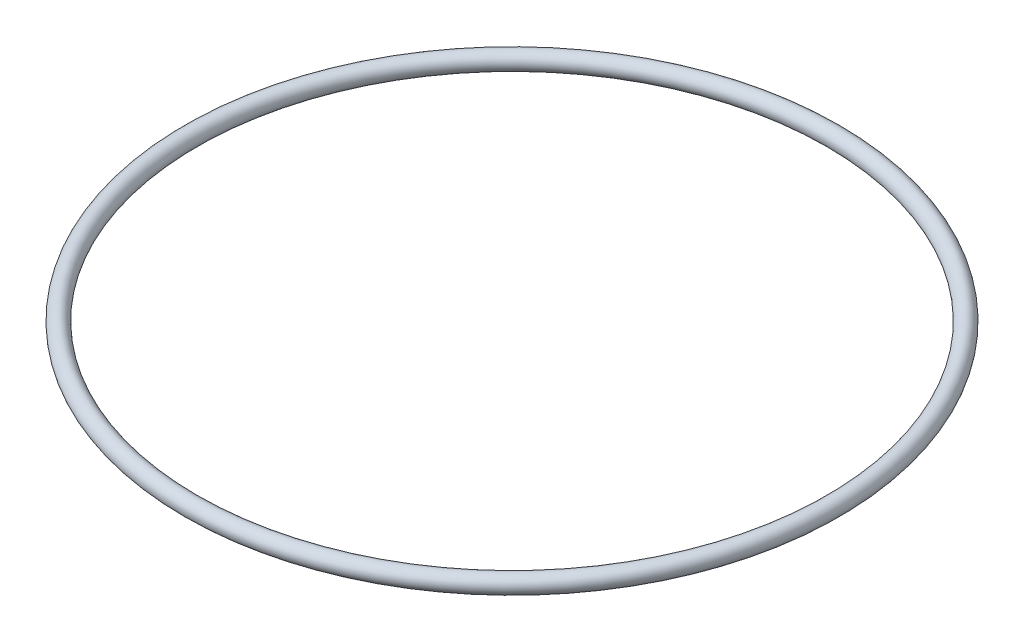
ISO-10303-21;
HEADER;
FILE_DESCRIPTION(('STEP AP214'),'2;1');
FILE_NAME('part.step','',(''),(''),'','','');
FILE_SCHEMA(('AUTOMOTIVE_DESIGN { 1 0 10303 214 1 1 1 1 }'));
ENDSEC;
DATA;
#1=APPLICATION_CONTEXT('core data for automotive mechanical design processes');
#2=APPLICATION_PROTOCOL_DEFINITION('international standard','automotive_design',2000,#1);
#3=PRODUCT_CONTEXT('',#1,'mechanical');
#4=PRODUCT('Part','Part','',(#3));
#5=PRODUCT_RELATED_PRODUCT_CATEGORY('part','',(#4));
#6=PRODUCT_DEFINITION_FORMATION('','',#4);
#7=PRODUCT_DEFINITION_CONTEXT('part definition',#1,'design');
#8=PRODUCT_DEFINITION('design','',#6,#7);
#9=PRODUCT_DEFINITION_SHAPE('','',#8);
#10=(LENGTH_UNIT() NAMED_UNIT(*) SI_UNIT(.MILLI.,.METRE.));
#11=(NAMED_UNIT(*) PLANE_ANGLE_UNIT() SI_UNIT($,.RADIAN.));
#12=(NAMED_UNIT(*) SI_UNIT($,.STERADIAN.) SOLID_ANGLE_UNIT());
#13=UNCERTAINTY_MEASURE_WITH_UNIT(LENGTH_MEASURE(1.E-05),#10,'distance_accuracy_value','');
#14=(GEOMETRIC_REPRESENTATION_CONTEXT(3) GLOBAL_UNCERTAINTY_ASSIGNED_CONTEXT((#13)) GLOBAL_UNIT_ASSIGNED_CONTEXT((#10,
#11,#12)) REPRESENTATION_CONTEXT('',''));
#15=CARTESIAN_POINT('',(0.,0.,0.));
#16=DIRECTION('',(0.,0.,1.));
#17=DIRECTION('',(1.,0.,0.));
#18=AXIS2_PLACEMENT_3D('',#15,#16,#17);
#19=CARTESIAN_POINT('',(0.,0.,0.));
#20=DIRECTION('',(0.,-1.,0.));
#21=DIRECTION('',(0.,0.,-1.));
#22=AXIS2_PLACEMENT_3D('',#19,#20,#21);
#23=TOROIDAL_SURFACE('',#22,55.,1.5);
#24=CARTESIAN_POINT('',(0.,0.,-56.5));
#25=VERTEX_POINT('',#24);
#26=VERTEX_LOOP('',#25);
#27=FACE_BOUND('',#26,.T.);
#28=ADVANCED_FACE('F28',(#27),#23,.T.);
#29=CLOSED_SHELL('',(#28));
#30=MANIFOLD_SOLID_BREP('B2',#29);
#31=ADVANCED_BREP_SHAPE_REPRESENTATION('',(#18,#30),#14);
#32=SHAPE_DEFINITION_REPRESENTATION(#9,#31);
ENDSEC;
END-ISO-10303-21;
